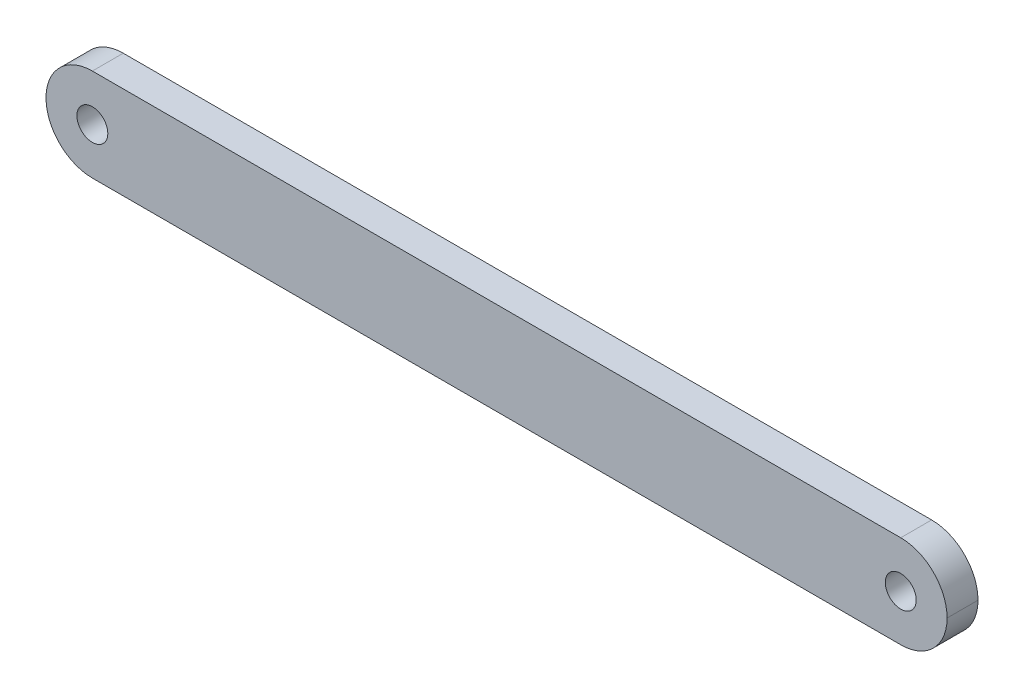
ISO-10303-21;
HEADER;
FILE_DESCRIPTION(('STEP AP214'),'2;1');
FILE_NAME('part.step','',(''),(''),'','','');
FILE_SCHEMA(('AUTOMOTIVE_DESIGN { 1 0 10303 214 1 1 1 1 }'));
ENDSEC;
DATA;
#1=APPLICATION_CONTEXT('core data for automotive mechanical design processes');
#2=APPLICATION_PROTOCOL_DEFINITION('international standard','automotive_design',2000,#1);
#3=PRODUCT_CONTEXT('',#1,'mechanical');
#4=PRODUCT('Part','Part','',(#3));
#5=PRODUCT_RELATED_PRODUCT_CATEGORY('part','',(#4));
#6=PRODUCT_DEFINITION_FORMATION('','',#4);
#7=PRODUCT_DEFINITION_CONTEXT('part definition',#1,'design');
#8=PRODUCT_DEFINITION('design','',#6,#7);
#9=PRODUCT_DEFINITION_SHAPE('','',#8);
#10=(LENGTH_UNIT() NAMED_UNIT(*) SI_UNIT(.MILLI.,.METRE.));
#11=(NAMED_UNIT(*) PLANE_ANGLE_UNIT() SI_UNIT($,.RADIAN.));
#12=(NAMED_UNIT(*) SI_UNIT($,.STERADIAN.) SOLID_ANGLE_UNIT());
#13=UNCERTAINTY_MEASURE_WITH_UNIT(LENGTH_MEASURE(1.E-05),#10,'distance_accuracy_value','');
#14=(GEOMETRIC_REPRESENTATION_CONTEXT(3) GLOBAL_UNCERTAINTY_ASSIGNED_CONTEXT((#13)) GLOBAL_UNIT_ASSIGNED_CONTEXT((#10,
#11,#12)) REPRESENTATION_CONTEXT('',''));
#15=CARTESIAN_POINT('',(0.,0.,0.));
#16=DIRECTION('',(0.,0.,1.));
#17=DIRECTION('',(1.,0.,0.));
#18=AXIS2_PLACEMENT_3D('',#15,#16,#17);
#19=CARTESIAN_POINT('',(0.,0.,2.));
#20=DIRECTION('',(0.,0.,-1.));
#21=DIRECTION('',(-1.,0.,0.));
#22=AXIS2_PLACEMENT_3D('',#19,#20,#21);
#23=PLANE('',#22);
#24=DIRECTION('',(1.,0.,0.));
#25=VECTOR('',#24,1.);
#26=CARTESIAN_POINT('',(0.,0.,2.));
#27=LINE('',#26,#25);
#28=CARTESIAN_POINT('',(3.,0.,2.));
#29=VERTEX_POINT('',#28);
#30=CARTESIAN_POINT('',(55.32,0.,2.));
#31=VERTEX_POINT('',#30);
#32=EDGE_CURVE('E135',#29,#31,#27,.T.);
#33=ORIENTED_EDGE('',*,*,#32,.T.);
#34=CARTESIAN_POINT('',(55.32,3.,2.));
#35=DIRECTION('',(0.,0.,-1.));
#36=DIRECTION('',(-1.,0.,0.));
#37=AXIS2_PLACEMENT_3D('',#34,#35,#36);
#38=CIRCLE('',#37,3.);
#39=CARTESIAN_POINT('',(58.32,3.,2.));
#40=VERTEX_POINT('',#39);
#41=EDGE_CURVE('E119',#31,#40,#38,.F.);
#42=ORIENTED_EDGE('',*,*,#41,.T.);
#43=CARTESIAN_POINT('',(55.32,3.,2.));
#44=DIRECTION('',(0.,0.,-1.));
#45=DIRECTION('',(-1.,0.,0.));
#46=AXIS2_PLACEMENT_3D('',#43,#44,#45);
#47=CIRCLE('',#46,3.);
#48=CARTESIAN_POINT('',(55.32,6.,2.));
#49=VERTEX_POINT('',#48);
#50=EDGE_CURVE('E56',#40,#49,#47,.F.);
#51=ORIENTED_EDGE('',*,*,#50,.T.);
#52=DIRECTION('',(-1.,0.,0.));
#53=VECTOR('',#52,1.);
#54=CARTESIAN_POINT('',(0.,6.,2.));
#55=LINE('',#54,#53);
#56=CARTESIAN_POINT('',(3.,6.,2.));
#57=VERTEX_POINT('',#56);
#58=EDGE_CURVE('E104',#49,#57,#55,.T.);
#59=ORIENTED_EDGE('',*,*,#58,.T.);
#60=CARTESIAN_POINT('',(3.,3.,2.));
#61=DIRECTION('',(0.,0.,-1.));
#62=DIRECTION('',(-1.,0.,0.));
#63=AXIS2_PLACEMENT_3D('',#60,#61,#62);
#64=CIRCLE('',#63,3.);
#65=CARTESIAN_POINT('',(0.,3.,2.));
#66=VERTEX_POINT('',#65);
#67=EDGE_CURVE('E123',#57,#66,#64,.F.);
#68=ORIENTED_EDGE('',*,*,#67,.T.);
#69=CARTESIAN_POINT('',(3.,3.,2.));
#70=DIRECTION('',(0.,0.,-1.));
#71=DIRECTION('',(-1.,0.,0.));
#72=AXIS2_PLACEMENT_3D('',#69,#70,#71);
#73=CIRCLE('',#72,3.);
#74=EDGE_CURVE('E107',#66,#29,#73,.F.);
#75=ORIENTED_EDGE('',*,*,#74,.T.);
#76=EDGE_LOOP('',(#33,#42,#51,#59,#68,#75));
#77=FACE_BOUND('',#76,.T.);
#78=CARTESIAN_POINT('',(3.,3.,2.));
#79=DIRECTION('',(0.,0.,1.));
#80=DIRECTION('',(1.,0.,0.));
#81=AXIS2_PLACEMENT_3D('',#78,#79,#80);
#82=CIRCLE('',#81,1.);
#83=CARTESIAN_POINT('',(4.,3.,2.));
#84=VERTEX_POINT('',#83);
#85=EDGE_CURVE('E137',#84,#84,#82,.T.);
#86=ORIENTED_EDGE('',*,*,#85,.F.);
#87=EDGE_LOOP('',(#86));
#88=FACE_BOUND('',#87,.T.);
#89=CARTESIAN_POINT('',(55.32,3.,2.));
#90=DIRECTION('',(0.,0.,1.));
#91=DIRECTION('',(1.,0.,0.));
#92=AXIS2_PLACEMENT_3D('',#89,#90,#91);
#93=CIRCLE('',#92,0.999999999999998);
#94=CARTESIAN_POINT('',(56.32,3.,2.));
#95=VERTEX_POINT('',#94);
#96=EDGE_CURVE('E115',#95,#95,#93,.T.);
#97=ORIENTED_EDGE('',*,*,#96,.F.);
#98=EDGE_LOOP('',(#97));
#99=FACE_BOUND('',#98,.T.);
#100=ADVANCED_FACE('F33',(#77,#88,#99),#23,.F.);
#101=CARTESIAN_POINT('',(0.,0.,0.));
#102=DIRECTION('',(0.,0.,-1.));
#103=DIRECTION('',(-1.,0.,0.));
#104=AXIS2_PLACEMENT_3D('',#101,#102,#103);
#105=PLANE('',#104);
#106=CARTESIAN_POINT('',(3.,3.,0.));
#107=DIRECTION('',(0.,0.,1.));
#108=DIRECTION('',(1.,0.,0.));
#109=AXIS2_PLACEMENT_3D('',#106,#107,#108);
#110=CIRCLE('',#109,1.);
#111=CARTESIAN_POINT('',(4.,3.,0.));
#112=VERTEX_POINT('',#111);
#113=EDGE_CURVE('E141',#112,#112,#110,.T.);
#114=ORIENTED_EDGE('',*,*,#113,.T.);
#115=EDGE_LOOP('',(#114));
#116=FACE_BOUND('',#115,.T.);
#117=CARTESIAN_POINT('',(55.32,3.,0.));
#118=DIRECTION('',(0.,0.,-1.));
#119=DIRECTION('',(-1.,0.,0.));
#120=AXIS2_PLACEMENT_3D('',#117,#118,#119);
#121=CIRCLE('',#120,3.);
#122=CARTESIAN_POINT('',(55.32,6.,0.));
#123=VERTEX_POINT('',#122);
#124=CARTESIAN_POINT('',(58.32,3.,0.));
#125=VERTEX_POINT('',#124);
#126=EDGE_CURVE('E98',#123,#125,#121,.T.);
#127=ORIENTED_EDGE('',*,*,#126,.T.);
#128=CARTESIAN_POINT('',(55.32,3.,0.));
#129=DIRECTION('',(0.,0.,-1.));
#130=DIRECTION('',(-1.,0.,0.));
#131=AXIS2_PLACEMENT_3D('',#128,#129,#130);
#132=CIRCLE('',#131,3.);
#133=CARTESIAN_POINT('',(55.32,0.,0.));
#134=VERTEX_POINT('',#133);
#135=EDGE_CURVE('E130',#125,#134,#132,.T.);
#136=ORIENTED_EDGE('',*,*,#135,.T.);
#137=DIRECTION('',(1.,0.,0.));
#138=VECTOR('',#137,1.);
#139=CARTESIAN_POINT('',(0.,0.,0.));
#140=LINE('',#139,#138);
#141=CARTESIAN_POINT('',(3.,0.,0.));
#142=VERTEX_POINT('',#141);
#143=EDGE_CURVE('E93',#142,#134,#140,.T.);
#144=ORIENTED_EDGE('',*,*,#143,.F.);
#145=CARTESIAN_POINT('',(3.,3.,0.));
#146=DIRECTION('',(0.,0.,-1.));
#147=DIRECTION('',(-1.,0.,0.));
#148=AXIS2_PLACEMENT_3D('',#145,#146,#147);
#149=CIRCLE('',#148,3.);
#150=CARTESIAN_POINT('',(0.,3.,0.));
#151=VERTEX_POINT('',#150);
#152=EDGE_CURVE('E86',#142,#151,#149,.T.);
#153=ORIENTED_EDGE('',*,*,#152,.T.);
#154=CARTESIAN_POINT('',(3.,3.,0.));
#155=DIRECTION('',(0.,0.,-1.));
#156=DIRECTION('',(-1.,0.,0.));
#157=AXIS2_PLACEMENT_3D('',#154,#155,#156);
#158=CIRCLE('',#157,3.);
#159=CARTESIAN_POINT('',(3.,6.,0.));
#160=VERTEX_POINT('',#159);
#161=EDGE_CURVE('E91',#151,#160,#158,.T.);
#162=ORIENTED_EDGE('',*,*,#161,.T.);
#163=DIRECTION('',(-1.,0.,0.));
#164=VECTOR('',#163,1.);
#165=CARTESIAN_POINT('',(0.,6.,0.));
#166=LINE('',#165,#164);
#167=EDGE_CURVE('E133',#123,#160,#166,.T.);
#168=ORIENTED_EDGE('',*,*,#167,.F.);
#169=EDGE_LOOP('',(#127,#136,#144,#153,#162,#168));
#170=FACE_BOUND('',#169,.T.);
#171=CARTESIAN_POINT('',(55.32,3.,0.));
#172=DIRECTION('',(0.,0.,1.));
#173=DIRECTION('',(1.,0.,0.));
#174=AXIS2_PLACEMENT_3D('',#171,#172,#173);
#175=CIRCLE('',#174,0.999999999999998);
#176=CARTESIAN_POINT('',(56.32,3.,0.));
#177=VERTEX_POINT('',#176);
#178=EDGE_CURVE('E110',#177,#177,#175,.T.);
#179=ORIENTED_EDGE('',*,*,#178,.T.);
#180=EDGE_LOOP('',(#179));
#181=FACE_BOUND('',#180,.T.);
#182=ADVANCED_FACE('F88',(#116,#170,#181),#105,.T.);
#183=CARTESIAN_POINT('',(0.,0.,2.));
#184=DIRECTION('',(0.,1.,0.));
#185=DIRECTION('',(0.,0.,1.));
#186=AXIS2_PLACEMENT_3D('',#183,#184,#185);
#187=PLANE('',#186);
#188=ORIENTED_EDGE('',*,*,#143,.T.);
#189=DIRECTION('',(0.,0.,-1.));
#190=VECTOR('',#189,1.);
#191=CARTESIAN_POINT('',(55.32,0.,2.));
#192=LINE('',#191,#190);
#193=EDGE_CURVE('E125',#134,#31,#192,.F.);
#194=ORIENTED_EDGE('',*,*,#193,.T.);
#195=ORIENTED_EDGE('',*,*,#32,.F.);
#196=DIRECTION('',(0.,0.,-1.));
#197=VECTOR('',#196,1.);
#198=CARTESIAN_POINT('',(3.,0.,2.));
#199=LINE('',#198,#197);
#200=EDGE_CURVE('E128',#29,#142,#199,.T.);
#201=ORIENTED_EDGE('',*,*,#200,.T.);
#202=EDGE_LOOP('',(#188,#194,#195,#201));
#203=FACE_BOUND('',#202,.T.);
#204=ADVANCED_FACE('F157',(#203),#187,.F.);
#205=CARTESIAN_POINT('',(0.,6.,2.));
#206=DIRECTION('',(0.,-1.,0.));
#207=DIRECTION('',(0.,0.,-1.));
#208=AXIS2_PLACEMENT_3D('',#205,#206,#207);
#209=PLANE('',#208);
#210=ORIENTED_EDGE('',*,*,#58,.F.);
#211=DIRECTION('',(0.,0.,-1.));
#212=VECTOR('',#211,1.);
#213=CARTESIAN_POINT('',(55.32,6.,2.));
#214=LINE('',#213,#212);
#215=EDGE_CURVE('E11',#49,#123,#214,.T.);
#216=ORIENTED_EDGE('',*,*,#215,.T.);
#217=ORIENTED_EDGE('',*,*,#167,.T.);
#218=DIRECTION('',(0.,0.,-1.));
#219=VECTOR('',#218,1.);
#220=CARTESIAN_POINT('',(3.,6.,2.));
#221=LINE('',#220,#219);
#222=EDGE_CURVE('E42',#160,#57,#221,.F.);
#223=ORIENTED_EDGE('',*,*,#222,.T.);
#224=EDGE_LOOP('',(#210,#216,#217,#223));
#225=FACE_BOUND('',#224,.T.);
#226=ADVANCED_FACE('F165',(#225),#209,.F.);
#227=CARTESIAN_POINT('',(3.,3.,2.));
#228=DIRECTION('',(0.,0.,-1.));
#229=DIRECTION('',(-1.,0.,0.));
#230=AXIS2_PLACEMENT_3D('',#227,#228,#229);
#231=CYLINDRICAL_SURFACE('',#230,1.);
#232=ORIENTED_EDGE('',*,*,#85,.T.);
#233=EDGE_LOOP('',(#232));
#234=FACE_BOUND('',#233,.T.);
#235=ORIENTED_EDGE('',*,*,#113,.F.);
#236=EDGE_LOOP('',(#235));
#237=FACE_BOUND('',#236,.T.);
#238=ADVANCED_FACE('F162',(#234,#237),#231,.F.);
#239=CARTESIAN_POINT('',(55.32,3.,2.));
#240=DIRECTION('',(0.,0.,-1.));
#241=DIRECTION('',(-1.,0.,0.));
#242=AXIS2_PLACEMENT_3D('',#239,#240,#241);
#243=CYLINDRICAL_SURFACE('',#242,0.999999999999998);
#244=ORIENTED_EDGE('',*,*,#96,.T.);
#245=EDGE_LOOP('',(#244));
#246=FACE_BOUND('',#245,.T.);
#247=ORIENTED_EDGE('',*,*,#178,.F.);
#248=EDGE_LOOP('',(#247));
#249=FACE_BOUND('',#248,.T.);
#250=ADVANCED_FACE('F149',(#246,#249),#243,.F.);
#251=CARTESIAN_POINT('',(55.32,3.,2.));
#252=DIRECTION('',(0.,0.,-1.));
#253=DIRECTION('',(-1.,0.,0.));
#254=AXIS2_PLACEMENT_3D('',#251,#252,#253);
#255=CYLINDRICAL_SURFACE('',#254,3.);
#256=ORIENTED_EDGE('',*,*,#215,.F.);
#257=ORIENTED_EDGE('',*,*,#50,.F.);
#258=DIRECTION('',(0.,0.,-1.));
#259=VECTOR('',#258,1.);
#260=CARTESIAN_POINT('',(58.32,3.,2.));
#261=LINE('',#260,#259);
#262=EDGE_CURVE('E108',#125,#40,#261,.F.);
#263=ORIENTED_EDGE('',*,*,#262,.F.);
#264=ORIENTED_EDGE('',*,*,#126,.F.);
#265=EDGE_LOOP('',(#256,#257,#263,#264));
#266=FACE_BOUND('',#265,.T.);
#267=ADVANCED_FACE('F174',(#266),#255,.T.);
#268=CARTESIAN_POINT('',(55.32,3.,2.));
#269=DIRECTION('',(0.,0.,-1.));
#270=DIRECTION('',(-1.,0.,0.));
#271=AXIS2_PLACEMENT_3D('',#268,#269,#270);
#272=CYLINDRICAL_SURFACE('',#271,3.);
#273=ORIENTED_EDGE('',*,*,#41,.F.);
#274=ORIENTED_EDGE('',*,*,#193,.F.);
#275=ORIENTED_EDGE('',*,*,#135,.F.);
#276=ORIENTED_EDGE('',*,*,#262,.T.);
#277=EDGE_LOOP('',(#273,#274,#275,#276));
#278=FACE_BOUND('',#277,.T.);
#279=ADVANCED_FACE('F171',(#278),#272,.T.);
#280=CARTESIAN_POINT('',(3.,3.,2.));
#281=DIRECTION('',(0.,0.,-1.));
#282=DIRECTION('',(-1.,0.,0.));
#283=AXIS2_PLACEMENT_3D('',#280,#281,#282);
#284=CYLINDRICAL_SURFACE('',#283,3.);
#285=DIRECTION('',(0.,0.,-1.));
#286=VECTOR('',#285,1.);
#287=CARTESIAN_POINT('',(0.,3.,2.));
#288=LINE('',#287,#286);
#289=EDGE_CURVE('E37',#66,#151,#288,.T.);
#290=ORIENTED_EDGE('',*,*,#289,.F.);
#291=ORIENTED_EDGE('',*,*,#67,.F.);
#292=ORIENTED_EDGE('',*,*,#222,.F.);
#293=ORIENTED_EDGE('',*,*,#161,.F.);
#294=EDGE_LOOP('',(#290,#291,#292,#293));
#295=FACE_BOUND('',#294,.T.);
#296=ADVANCED_FACE('F35',(#295),#284,.T.);
#297=CARTESIAN_POINT('',(3.,3.,2.));
#298=DIRECTION('',(0.,0.,-1.));
#299=DIRECTION('',(-1.,0.,0.));
#300=AXIS2_PLACEMENT_3D('',#297,#298,#299);
#301=CYLINDRICAL_SURFACE('',#300,3.);
#302=ORIENTED_EDGE('',*,*,#74,.F.);
#303=ORIENTED_EDGE('',*,*,#289,.T.);
#304=ORIENTED_EDGE('',*,*,#152,.F.);
#305=ORIENTED_EDGE('',*,*,#200,.F.);
#306=EDGE_LOOP('',(#302,#303,#304,#305));
#307=FACE_BOUND('',#306,.T.);
#308=ADVANCED_FACE('F106',(#307),#301,.T.);
#309=CLOSED_SHELL('',(#100,#182,#204,#226,#238,#250,#267,#279,#296,#308));
#310=MANIFOLD_SOLID_BREP('B2',#309);
#311=ADVANCED_BREP_SHAPE_REPRESENTATION('',(#18,#310),#14);
#312=SHAPE_DEFINITION_REPRESENTATION(#9,#311);
ENDSEC;
END-ISO-10303-21;
